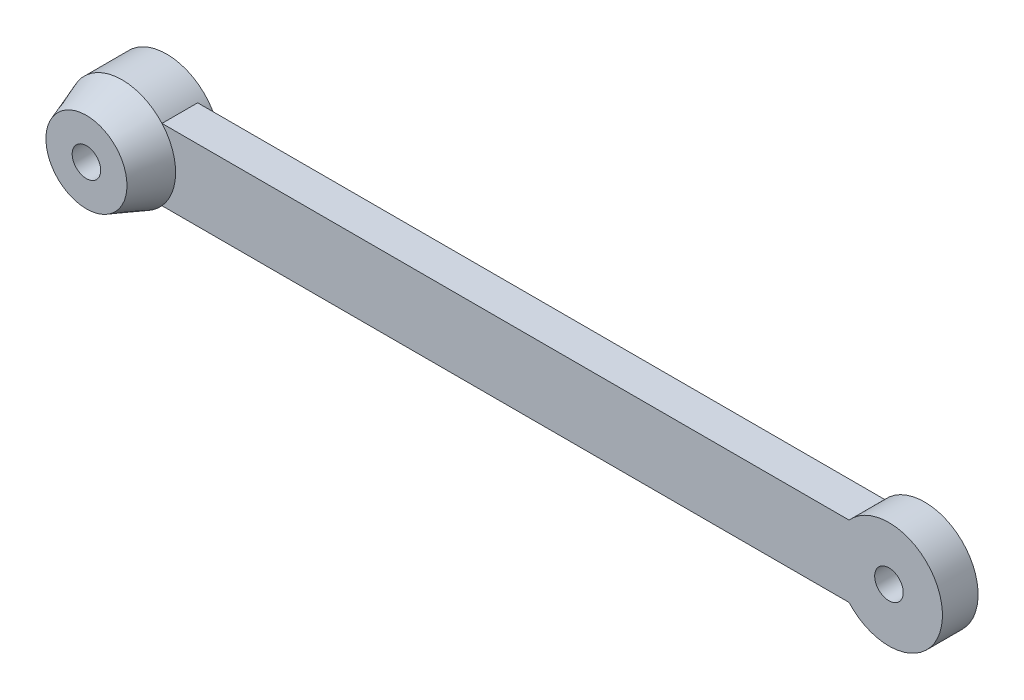
ISO-10303-21;
HEADER;
FILE_DESCRIPTION(('STEP AP214'),'2;1');
FILE_NAME('part.step','',(''),(''),'','','');
FILE_SCHEMA(('AUTOMOTIVE_DESIGN { 1 0 10303 214 1 1 1 1 }'));
ENDSEC;
DATA;
#1=APPLICATION_CONTEXT('core data for automotive mechanical design processes');
#2=APPLICATION_PROTOCOL_DEFINITION('international standard','automotive_design',2000,#1);
#3=PRODUCT_CONTEXT('',#1,'mechanical');
#4=PRODUCT('Part','Part','',(#3));
#5=PRODUCT_RELATED_PRODUCT_CATEGORY('part','',(#4));
#6=PRODUCT_DEFINITION_FORMATION('','',#4);
#7=PRODUCT_DEFINITION_CONTEXT('part definition',#1,'design');
#8=PRODUCT_DEFINITION('design','',#6,#7);
#9=PRODUCT_DEFINITION_SHAPE('','',#8);
#10=(LENGTH_UNIT() NAMED_UNIT(*) SI_UNIT(.MILLI.,.METRE.));
#11=(NAMED_UNIT(*) PLANE_ANGLE_UNIT() SI_UNIT($,.RADIAN.));
#12=(NAMED_UNIT(*) SI_UNIT($,.STERADIAN.) SOLID_ANGLE_UNIT());
#13=UNCERTAINTY_MEASURE_WITH_UNIT(LENGTH_MEASURE(1.E-05),#10,'distance_accuracy_value','');
#14=(GEOMETRIC_REPRESENTATION_CONTEXT(3) GLOBAL_UNCERTAINTY_ASSIGNED_CONTEXT((#13)) GLOBAL_UNIT_ASSIGNED_CONTEXT((#10,
#11,#12)) REPRESENTATION_CONTEXT('',''));
#15=CARTESIAN_POINT('',(0.,0.,0.));
#16=DIRECTION('',(0.,0.,1.));
#17=DIRECTION('',(1.,0.,0.));
#18=AXIS2_PLACEMENT_3D('',#15,#16,#17);
#19=CARTESIAN_POINT('',(0.,0.,0.));
#20=DIRECTION('',(0.,0.,1.));
#21=DIRECTION('',(1.,0.,0.));
#22=AXIS2_PLACEMENT_3D('',#19,#20,#21);
#23=PLANE('',#22);
#24=CARTESIAN_POINT('',(215.,0.,0.));
#25=DIRECTION('',(0.,0.,-1.));
#26=DIRECTION('',(-1.,0.,0.));
#27=AXIS2_PLACEMENT_3D('',#24,#25,#26);
#28=CIRCLE('',#27,3.99999999999999);
#29=CARTESIAN_POINT('',(211.,0.,0.));
#30=VERTEX_POINT('',#29);
#31=EDGE_CURVE('E123',#30,#30,#28,.T.);
#32=ORIENTED_EDGE('',*,*,#31,.F.);
#33=EDGE_LOOP('',(#32));
#34=FACE_BOUND('',#33,.T.);
#35=CARTESIAN_POINT('',(0.,0.,0.));
#36=DIRECTION('',(0.,0.,-1.));
#37=DIRECTION('',(-1.,0.,0.));
#38=AXIS2_PLACEMENT_3D('',#35,#36,#37);
#39=CIRCLE('',#38,15.);
#40=CARTESIAN_POINT('',(11.1803398874989,10.,0.));
#41=VERTEX_POINT('',#40);
#42=CARTESIAN_POINT('',(11.1803398874989,-10.,0.));
#43=VERTEX_POINT('',#42);
#44=EDGE_CURVE('E83',#41,#43,#39,.T.);
#45=ORIENTED_EDGE('',*,*,#44,.F.);
#46=DIRECTION('',(1.,0.,0.));
#47=VECTOR('',#46,1.);
#48=CARTESIAN_POINT('',(0.,10.,0.));
#49=LINE('',#48,#47);
#50=CARTESIAN_POINT('',(203.819660112501,10.,0.));
#51=VERTEX_POINT('',#50);
#52=EDGE_CURVE('E84',#41,#51,#49,.T.);
#53=ORIENTED_EDGE('',*,*,#52,.T.);
#54=CARTESIAN_POINT('',(215.,0.,0.));
#55=DIRECTION('',(0.,0.,1.));
#56=DIRECTION('',(1.,0.,0.));
#57=AXIS2_PLACEMENT_3D('',#54,#55,#56);
#58=CIRCLE('',#57,15.);
#59=CARTESIAN_POINT('',(203.819660112501,-10.,0.));
#60=VERTEX_POINT('',#59);
#61=EDGE_CURVE('E45',#60,#51,#58,.T.);
#62=ORIENTED_EDGE('',*,*,#61,.F.);
#63=DIRECTION('',(-1.,0.,0.));
#64=VECTOR('',#63,1.);
#65=CARTESIAN_POINT('',(0.,-10.,0.));
#66=LINE('',#65,#64);
#67=EDGE_CURVE('E86',#60,#43,#66,.T.);
#68=ORIENTED_EDGE('',*,*,#67,.T.);
#69=EDGE_LOOP('',(#45,#53,#62,#68));
#70=FACE_BOUND('',#69,.T.);
#71=ADVANCED_FACE('F41',(#34,#70),#23,.F.);
#72=CARTESIAN_POINT('',(215.,0.,10.));
#73=DIRECTION('',(0.,0.,-1.));
#74=DIRECTION('',(-1.,0.,0.));
#75=AXIS2_PLACEMENT_3D('',#72,#73,#74);
#76=CYLINDRICAL_SURFACE('',#75,15.);
#77=CARTESIAN_POINT('',(215.,0.,10.));
#78=DIRECTION('',(0.,0.,1.));
#79=DIRECTION('',(1.,0.,0.));
#80=AXIS2_PLACEMENT_3D('',#77,#78,#79);
#81=CIRCLE('',#80,15.);
#82=CARTESIAN_POINT('',(203.819660112501,-10.,10.));
#83=VERTEX_POINT('',#82);
#84=CARTESIAN_POINT('',(203.819660112501,10.,10.));
#85=VERTEX_POINT('',#84);
#86=EDGE_CURVE('E11',#83,#85,#81,.T.);
#87=ORIENTED_EDGE('',*,*,#86,.F.);
#88=DIRECTION('',(0.,0.,-1.));
#89=VECTOR('',#88,1.);
#90=CARTESIAN_POINT('',(203.819660112501,-10.,5.));
#91=LINE('',#90,#89);
#92=EDGE_CURVE('E103',#83,#60,#91,.T.);
#93=ORIENTED_EDGE('',*,*,#92,.T.);
#94=ORIENTED_EDGE('',*,*,#61,.T.);
#95=DIRECTION('',(0.,0.,-1.));
#96=VECTOR('',#95,1.);
#97=CARTESIAN_POINT('',(203.819660112501,10.,5.));
#98=LINE('',#97,#96);
#99=EDGE_CURVE('E93',#85,#51,#98,.T.);
#100=ORIENTED_EDGE('',*,*,#99,.F.);
#101=EDGE_LOOP('',(#87,#93,#94,#100));
#102=FACE_BOUND('',#101,.T.);
#103=ADVANCED_FACE('F43',(#102),#76,.T.);
#104=CARTESIAN_POINT('',(0.,0.,10.));
#105=DIRECTION('',(0.,0.,-1.));
#106=DIRECTION('',(-1.,0.,0.));
#107=AXIS2_PLACEMENT_3D('',#104,#105,#106);
#108=CYLINDRICAL_SURFACE('',#107,15.);
#109=DIRECTION('',(0.,0.,-1.));
#110=VECTOR('',#109,1.);
#111=CARTESIAN_POINT('',(11.1803398874989,-10.,5.));
#112=LINE('',#111,#110);
#113=CARTESIAN_POINT('',(11.1803398874989,-10.,10.));
#114=VERTEX_POINT('',#113);
#115=EDGE_CURVE('E100',#114,#43,#112,.T.);
#116=ORIENTED_EDGE('',*,*,#115,.F.);
#117=CARTESIAN_POINT('',(0.,0.,10.));
#118=DIRECTION('',(0.,0.,1.));
#119=DIRECTION('',(1.,0.,0.));
#120=AXIS2_PLACEMENT_3D('',#117,#118,#119);
#121=CIRCLE('',#120,15.);
#122=CARTESIAN_POINT('',(11.1803398874989,10.,10.));
#123=VERTEX_POINT('',#122);
#124=EDGE_CURVE('E94',#123,#114,#121,.T.);
#125=ORIENTED_EDGE('',*,*,#124,.F.);
#126=DIRECTION('',(0.,0.,-1.));
#127=VECTOR('',#126,1.);
#128=CARTESIAN_POINT('',(11.1803398874989,10.,5.));
#129=LINE('',#128,#127);
#130=EDGE_CURVE('E56',#123,#41,#129,.T.);
#131=ORIENTED_EDGE('',*,*,#130,.T.);
#132=ORIENTED_EDGE('',*,*,#44,.T.);
#133=EDGE_LOOP('',(#116,#125,#131,#132));
#134=FACE_BOUND('',#133,.T.);
#135=CARTESIAN_POINT('',(0.,0.,-2.5));
#136=DIRECTION('',(0.,0.,-1.));
#137=DIRECTION('',(-1.,0.,0.));
#138=AXIS2_PLACEMENT_3D('',#135,#136,#137);
#139=CIRCLE('',#138,15.);
#140=CARTESIAN_POINT('',(-15.,0.,-2.5));
#141=VERTEX_POINT('',#140);
#142=EDGE_CURVE('E89',#141,#141,#139,.T.);
#143=ORIENTED_EDGE('',*,*,#142,.F.);
#144=EDGE_LOOP('',(#143));
#145=FACE_BOUND('',#144,.T.);
#146=ADVANCED_FACE('F97',(#134,#145),#108,.T.);
#147=CARTESIAN_POINT('',(0.,0.,10.));
#148=DIRECTION('',(0.,0.,1.));
#149=DIRECTION('',(1.,0.,0.));
#150=AXIS2_PLACEMENT_3D('',#147,#148,#149);
#151=PLANE('',#150);
#152=CARTESIAN_POINT('',(215.,0.,10.));
#153=DIRECTION('',(0.,0.,1.));
#154=DIRECTION('',(1.,0.,0.));
#155=AXIS2_PLACEMENT_3D('',#152,#153,#154);
#156=CIRCLE('',#155,3.99999999999999);
#157=CARTESIAN_POINT('',(219.,0.,10.));
#158=VERTEX_POINT('',#157);
#159=EDGE_CURVE('E120',#158,#158,#156,.T.);
#160=ORIENTED_EDGE('',*,*,#159,.F.);
#161=EDGE_LOOP('',(#160));
#162=FACE_BOUND('',#161,.T.);
#163=ORIENTED_EDGE('',*,*,#86,.T.);
#164=DIRECTION('',(-1.,0.,0.));
#165=VECTOR('',#164,1.);
#166=CARTESIAN_POINT('',(0.,10.,10.));
#167=LINE('',#166,#165);
#168=EDGE_CURVE('E115',#85,#123,#167,.T.);
#169=ORIENTED_EDGE('',*,*,#168,.T.);
#170=CARTESIAN_POINT('',(0.,0.,10.));
#171=DIRECTION('',(0.,0.,1.));
#172=DIRECTION('',(1.,0.,0.));
#173=AXIS2_PLACEMENT_3D('',#170,#171,#172);
#174=CIRCLE('',#173,15.);
#175=EDGE_CURVE('E112',#123,#114,#174,.F.);
#176=ORIENTED_EDGE('',*,*,#175,.T.);
#177=DIRECTION('',(1.,0.,0.));
#178=VECTOR('',#177,1.);
#179=CARTESIAN_POINT('',(0.,-10.,10.));
#180=LINE('',#179,#178);
#181=EDGE_CURVE('E117',#114,#83,#180,.T.);
#182=ORIENTED_EDGE('',*,*,#181,.T.);
#183=EDGE_LOOP('',(#163,#169,#176,#182));
#184=FACE_BOUND('',#183,.T.);
#185=ADVANCED_FACE('F153',(#162,#184),#151,.T.);
#186=CARTESIAN_POINT('',(0.,10.,5.));
#187=DIRECTION('',(0.,1.,0.));
#188=DIRECTION('',(0.,0.,1.));
#189=AXIS2_PLACEMENT_3D('',#186,#187,#188);
#190=PLANE('',#189);
#191=ORIENTED_EDGE('',*,*,#52,.F.);
#192=ORIENTED_EDGE('',*,*,#130,.F.);
#193=ORIENTED_EDGE('',*,*,#168,.F.);
#194=ORIENTED_EDGE('',*,*,#99,.T.);
#195=EDGE_LOOP('',(#191,#192,#193,#194));
#196=FACE_BOUND('',#195,.T.);
#197=ADVANCED_FACE('F92',(#196),#190,.T.);
#198=CARTESIAN_POINT('',(0.,-10.,5.));
#199=DIRECTION('',(0.,-1.,0.));
#200=DIRECTION('',(1.,0.,0.));
#201=AXIS2_PLACEMENT_3D('',#198,#199,#200);
#202=PLANE('',#201);
#203=ORIENTED_EDGE('',*,*,#67,.F.);
#204=ORIENTED_EDGE('',*,*,#92,.F.);
#205=ORIENTED_EDGE('',*,*,#181,.F.);
#206=ORIENTED_EDGE('',*,*,#115,.T.);
#207=EDGE_LOOP('',(#203,#204,#205,#206));
#208=FACE_BOUND('',#207,.T.);
#209=ADVANCED_FACE('F159',(#208),#202,.T.);
#210=CARTESIAN_POINT('',(0.,0.,10.));
#211=DIRECTION('',(0.,0.,-1.));
#212=DIRECTION('',(1.,0.,0.));
#213=AXIS2_PLACEMENT_3D('',#210,#211,#212);
#214=CONICAL_SURFACE('',#213,15.,0.349065850398866);
#215=CARTESIAN_POINT('',(0.,0.,20.));
#216=DIRECTION('',(0.,0.,1.));
#217=DIRECTION('',(1.,0.,0.));
#218=AXIS2_PLACEMENT_3D('',#215,#216,#217);
#219=CIRCLE('',#218,11.360297657338);
#220=CARTESIAN_POINT('',(11.360297657338,0.,20.));
#221=VERTEX_POINT('',#220);
#222=EDGE_CURVE('E109',#221,#221,#219,.T.);
#223=ORIENTED_EDGE('',*,*,#222,.F.);
#224=EDGE_LOOP('',(#223));
#225=FACE_BOUND('',#224,.T.);
#226=ORIENTED_EDGE('',*,*,#124,.T.);
#227=ORIENTED_EDGE('',*,*,#175,.F.);
#228=EDGE_LOOP('',(#226,#227));
#229=FACE_BOUND('',#228,.T.);
#230=ADVANCED_FACE('F162',(#225,#229),#214,.T.);
#231=CARTESIAN_POINT('',(0.,0.,20.));
#232=DIRECTION('',(0.,0.,1.));
#233=DIRECTION('',(1.,0.,0.));
#234=AXIS2_PLACEMENT_3D('',#231,#232,#233);
#235=PLANE('',#234);
#236=CARTESIAN_POINT('',(0.,0.,20.));
#237=DIRECTION('',(0.,0.,-1.));
#238=DIRECTION('',(-1.,0.,0.));
#239=AXIS2_PLACEMENT_3D('',#236,#237,#238);
#240=CIRCLE('',#239,4.);
#241=CARTESIAN_POINT('',(-4.,0.,20.));
#242=VERTEX_POINT('',#241);
#243=EDGE_CURVE('E126',#242,#242,#240,.T.);
#244=ORIENTED_EDGE('',*,*,#243,.T.);
#245=EDGE_LOOP('',(#244));
#246=FACE_BOUND('',#245,.T.);
#247=ORIENTED_EDGE('',*,*,#222,.T.);
#248=EDGE_LOOP('',(#247));
#249=FACE_BOUND('',#248,.T.);
#250=ADVANCED_FACE('F168',(#246,#249),#235,.T.);
#251=CARTESIAN_POINT('',(215.,0.,20.));
#252=DIRECTION('',(0.,0.,-1.));
#253=DIRECTION('',(-1.,0.,0.));
#254=AXIS2_PLACEMENT_3D('',#251,#252,#253);
#255=CYLINDRICAL_SURFACE('',#254,3.99999999999999);
#256=ORIENTED_EDGE('',*,*,#159,.T.);
#257=EDGE_LOOP('',(#256));
#258=FACE_BOUND('',#257,.T.);
#259=ORIENTED_EDGE('',*,*,#31,.T.);
#260=EDGE_LOOP('',(#259));
#261=FACE_BOUND('',#260,.T.);
#262=ADVANCED_FACE('F143',(#258,#261),#255,.F.);
#263=CARTESIAN_POINT('',(0.,0.,20.));
#264=DIRECTION('',(0.,0.,-1.));
#265=DIRECTION('',(-1.,0.,0.));
#266=AXIS2_PLACEMENT_3D('',#263,#264,#265);
#267=CYLINDRICAL_SURFACE('',#266,4.);
#268=ORIENTED_EDGE('',*,*,#243,.F.);
#269=EDGE_LOOP('',(#268));
#270=FACE_BOUND('',#269,.T.);
#271=CARTESIAN_POINT('',(0.,0.,-2.5));
#272=DIRECTION('',(0.,0.,-1.));
#273=DIRECTION('',(-1.,0.,0.));
#274=AXIS2_PLACEMENT_3D('',#271,#272,#273);
#275=CIRCLE('',#274,4.);
#276=CARTESIAN_POINT('',(-4.,0.,-2.5));
#277=VERTEX_POINT('',#276);
#278=EDGE_CURVE('E90',#277,#277,#275,.T.);
#279=ORIENTED_EDGE('',*,*,#278,.T.);
#280=EDGE_LOOP('',(#279));
#281=FACE_BOUND('',#280,.T.);
#282=ADVANCED_FACE('F134',(#270,#281),#267,.F.);
#283=CARTESIAN_POINT('',(0.,0.,-2.5));
#284=DIRECTION('',(0.,0.,-1.));
#285=DIRECTION('',(-1.,0.,0.));
#286=AXIS2_PLACEMENT_3D('',#283,#284,#285);
#287=PLANE('',#286);
#288=ORIENTED_EDGE('',*,*,#142,.T.);
#289=EDGE_LOOP('',(#288));
#290=FACE_BOUND('',#289,.T.);
#291=ORIENTED_EDGE('',*,*,#278,.F.);
#292=EDGE_LOOP('',(#291));
#293=FACE_BOUND('',#292,.T.);
#294=ADVANCED_FACE('F136',(#290,#293),#287,.T.);
#295=CLOSED_SHELL('',(#71,#103,#146,#185,#197,#209,#230,#250,#262,#282,#294));
#296=MANIFOLD_SOLID_BREP('B2',#295);
#297=ADVANCED_BREP_SHAPE_REPRESENTATION('',(#18,#296),#14);
#298=SHAPE_DEFINITION_REPRESENTATION(#9,#297);
ENDSEC;
END-ISO-10303-21;
